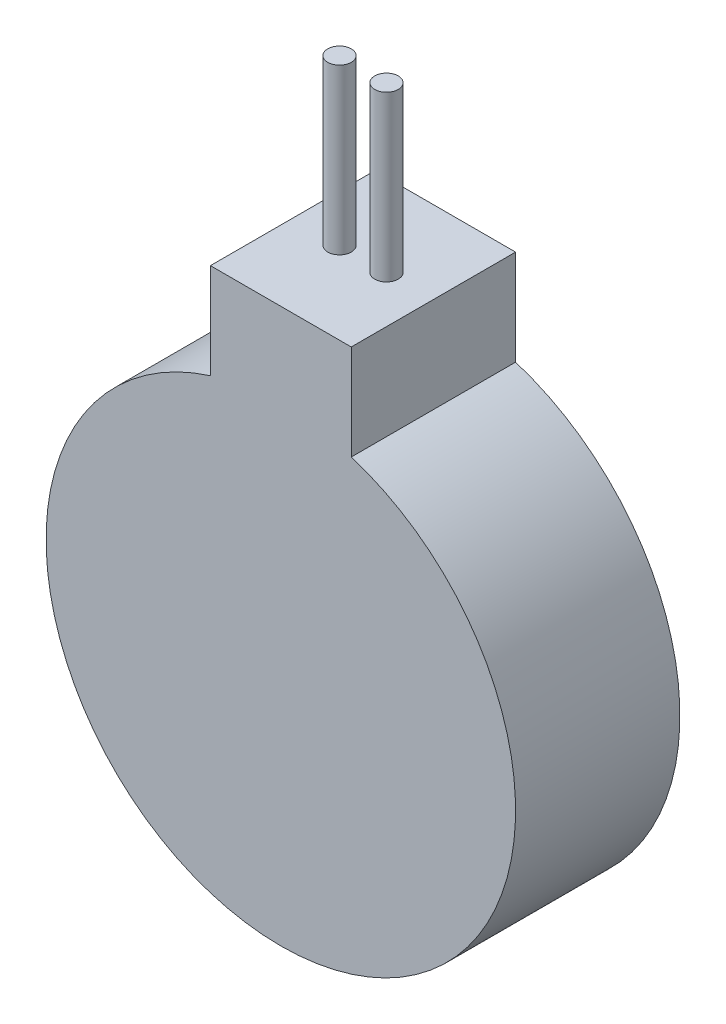
ISO-10303-21;
HEADER;
FILE_DESCRIPTION(('STEP AP214'),'2;1');
FILE_NAME('part.step','',(''),(''),'','','');
FILE_SCHEMA(('AUTOMOTIVE_DESIGN { 1 0 10303 214 1 1 1 1 }'));
ENDSEC;
DATA;
#1=APPLICATION_CONTEXT('core data for automotive mechanical design processes');
#2=APPLICATION_PROTOCOL_DEFINITION('international standard','automotive_design',2000,#1);
#3=PRODUCT_CONTEXT('',#1,'mechanical');
#4=PRODUCT('Part','Part','',(#3));
#5=PRODUCT_RELATED_PRODUCT_CATEGORY('part','',(#4));
#6=PRODUCT_DEFINITION_FORMATION('','',#4);
#7=PRODUCT_DEFINITION_CONTEXT('part definition',#1,'design');
#8=PRODUCT_DEFINITION('design','',#6,#7);
#9=PRODUCT_DEFINITION_SHAPE('','',#8);
#10=(LENGTH_UNIT() NAMED_UNIT(*) SI_UNIT(.MILLI.,.METRE.));
#11=(NAMED_UNIT(*) PLANE_ANGLE_UNIT() SI_UNIT($,.RADIAN.));
#12=(NAMED_UNIT(*) SI_UNIT($,.STERADIAN.) SOLID_ANGLE_UNIT());
#13=UNCERTAINTY_MEASURE_WITH_UNIT(LENGTH_MEASURE(1.E-05),#10,'distance_accuracy_value','');
#14=(GEOMETRIC_REPRESENTATION_CONTEXT(3) GLOBAL_UNCERTAINTY_ASSIGNED_CONTEXT((#13)) GLOBAL_UNIT_ASSIGNED_CONTEXT((#10,
#11,#12)) REPRESENTATION_CONTEXT('',''));
#15=CARTESIAN_POINT('',(0.,0.,0.));
#16=DIRECTION('',(0.,0.,1.));
#17=DIRECTION('',(1.,0.,0.));
#18=AXIS2_PLACEMENT_3D('',#15,#16,#17);
#19=CARTESIAN_POINT('',(-1.5,6.8,3.5));
#20=DIRECTION('',(0.,-1.,0.));
#21=DIRECTION('',(0.,0.,-1.));
#22=AXIS2_PLACEMENT_3D('',#19,#20,#21);
#23=PLANE('',#22);
#24=CARTESIAN_POINT('',(-0.5,6.8,1.75));
#25=DIRECTION('',(0.,-1.,0.));
#26=DIRECTION('',(0.,0.,-1.));
#27=AXIS2_PLACEMENT_3D('',#24,#25,#26);
#28=CIRCLE('',#27,0.25);
#29=CARTESIAN_POINT('',(-0.5,6.8,1.5));
#30=VERTEX_POINT('',#29);
#31=EDGE_CURVE('E42',#30,#30,#28,.F.);
#32=ORIENTED_EDGE('',*,*,#31,.F.);
#33=EDGE_LOOP('',(#32));
#34=FACE_BOUND('',#33,.T.);
#35=DIRECTION('',(-1.,0.,0.));
#36=VECTOR('',#35,1.);
#37=CARTESIAN_POINT('',(-1.5,6.8,0.));
#38=LINE('',#37,#36);
#39=CARTESIAN_POINT('',(1.5,6.8,0.));
#40=VERTEX_POINT('',#39);
#41=CARTESIAN_POINT('',(-1.5,6.8,0.));
#42=VERTEX_POINT('',#41);
#43=EDGE_CURVE('E91',#40,#42,#38,.T.);
#44=ORIENTED_EDGE('',*,*,#43,.T.);
#45=DIRECTION('',(0.,0.,-1.));
#46=VECTOR('',#45,1.);
#47=CARTESIAN_POINT('',(-1.5,6.8,3.5));
#48=LINE('',#47,#46);
#49=CARTESIAN_POINT('',(-1.5,6.8,3.5));
#50=VERTEX_POINT('',#49);
#51=EDGE_CURVE('E89',#50,#42,#48,.T.);
#52=ORIENTED_EDGE('',*,*,#51,.F.);
#53=DIRECTION('',(-1.,0.,0.));
#54=VECTOR('',#53,1.);
#55=CARTESIAN_POINT('',(-1.5,6.8,3.5));
#56=LINE('',#55,#54);
#57=CARTESIAN_POINT('',(1.5,6.8,3.5));
#58=VERTEX_POINT('',#57);
#59=EDGE_CURVE('E81',#58,#50,#56,.T.);
#60=ORIENTED_EDGE('',*,*,#59,.F.);
#61=DIRECTION('',(0.,0.,-1.));
#62=VECTOR('',#61,1.);
#63=CARTESIAN_POINT('',(1.5,6.8,3.5));
#64=LINE('',#63,#62);
#65=EDGE_CURVE('E92',#58,#40,#64,.T.);
#66=ORIENTED_EDGE('',*,*,#65,.T.);
#67=EDGE_LOOP('',(#44,#52,#60,#66));
#68=FACE_BOUND('',#67,.T.);
#69=CARTESIAN_POINT('',(0.500000000000001,6.8,1.75));
#70=DIRECTION('',(0.,-1.,0.));
#71=DIRECTION('',(0.,0.,-1.));
#72=AXIS2_PLACEMENT_3D('',#69,#70,#71);
#73=CIRCLE('',#72,0.25);
#74=CARTESIAN_POINT('',(0.500000000000001,6.8,1.5));
#75=VERTEX_POINT('',#74);
#76=EDGE_CURVE('E11',#75,#75,#73,.F.);
#77=ORIENTED_EDGE('',*,*,#76,.F.);
#78=EDGE_LOOP('',(#77));
#79=FACE_BOUND('',#78,.T.);
#80=ADVANCED_FACE('F33',(#34,#68,#79),#23,.F.);
#81=CARTESIAN_POINT('',(1.5,4.76969600708473,3.5));
#82=DIRECTION('',(-1.,0.,0.));
#83=DIRECTION('',(0.,0.,1.));
#84=AXIS2_PLACEMENT_3D('',#81,#82,#83);
#85=PLANE('',#84);
#86=DIRECTION('',(0.,1.,0.));
#87=VECTOR('',#86,1.);
#88=CARTESIAN_POINT('',(1.5,4.76969600708473,0.));
#89=LINE('',#88,#87);
#90=CARTESIAN_POINT('',(1.5,4.76969600708473,0.));
#91=VERTEX_POINT('',#90);
#92=EDGE_CURVE('E101',#91,#40,#89,.T.);
#93=ORIENTED_EDGE('',*,*,#92,.T.);
#94=ORIENTED_EDGE('',*,*,#65,.F.);
#95=DIRECTION('',(0.,1.,0.));
#96=VECTOR('',#95,1.);
#97=CARTESIAN_POINT('',(1.5,4.76969600708473,3.5));
#98=LINE('',#97,#96);
#99=CARTESIAN_POINT('',(1.5,4.76969600708473,3.5));
#100=VERTEX_POINT('',#99);
#101=EDGE_CURVE('E86',#100,#58,#98,.T.);
#102=ORIENTED_EDGE('',*,*,#101,.F.);
#103=DIRECTION('',(0.,0.,-1.));
#104=VECTOR('',#103,1.);
#105=CARTESIAN_POINT('',(1.5,4.76969600708473,3.5));
#106=LINE('',#105,#104);
#107=EDGE_CURVE('E97',#100,#91,#106,.T.);
#108=ORIENTED_EDGE('',*,*,#107,.T.);
#109=EDGE_LOOP('',(#93,#94,#102,#108));
#110=FACE_BOUND('',#109,.T.);
#111=ADVANCED_FACE('F35',(#110),#85,.F.);
#112=CARTESIAN_POINT('',(-1.5,4.76969600708473,3.5));
#113=DIRECTION('',(1.,0.,0.));
#114=DIRECTION('',(0.,1.,0.));
#115=AXIS2_PLACEMENT_3D('',#112,#113,#114);
#116=PLANE('',#115);
#117=DIRECTION('',(0.,-1.,0.));
#118=VECTOR('',#117,1.);
#119=CARTESIAN_POINT('',(-1.5,4.76969600708473,0.));
#120=LINE('',#119,#118);
#121=CARTESIAN_POINT('',(-1.5,4.76969600708473,0.));
#122=VERTEX_POINT('',#121);
#123=EDGE_CURVE('E67',#42,#122,#120,.T.);
#124=ORIENTED_EDGE('',*,*,#123,.T.);
#125=DIRECTION('',(0.,0.,-1.));
#126=VECTOR('',#125,1.);
#127=CARTESIAN_POINT('',(-1.5,4.76969600708473,3.5));
#128=LINE('',#127,#126);
#129=CARTESIAN_POINT('',(-1.5,4.76969600708473,3.5));
#130=VERTEX_POINT('',#129);
#131=EDGE_CURVE('E93',#130,#122,#128,.T.);
#132=ORIENTED_EDGE('',*,*,#131,.F.);
#133=DIRECTION('',(0.,-1.,0.));
#134=VECTOR('',#133,1.);
#135=CARTESIAN_POINT('',(-1.5,4.76969600708473,3.5));
#136=LINE('',#135,#134);
#137=EDGE_CURVE('E84',#50,#130,#136,.T.);
#138=ORIENTED_EDGE('',*,*,#137,.F.);
#139=ORIENTED_EDGE('',*,*,#51,.T.);
#140=EDGE_LOOP('',(#124,#132,#138,#139));
#141=FACE_BOUND('',#140,.T.);
#142=ADVANCED_FACE('F95',(#141),#116,.F.);
#143=CARTESIAN_POINT('',(0.,0.,3.5));
#144=DIRECTION('',(0.,0.,-1.));
#145=DIRECTION('',(-1.,0.,0.));
#146=AXIS2_PLACEMENT_3D('',#143,#144,#145);
#147=CYLINDRICAL_SURFACE('',#146,5.);
#148=CARTESIAN_POINT('',(0.,0.,0.));
#149=DIRECTION('',(0.,0.,1.));
#150=DIRECTION('',(1.,0.,0.));
#151=AXIS2_PLACEMENT_3D('',#148,#149,#150);
#152=CIRCLE('',#151,5.);
#153=EDGE_CURVE('E73',#122,#91,#152,.T.);
#154=ORIENTED_EDGE('',*,*,#153,.T.);
#155=ORIENTED_EDGE('',*,*,#107,.F.);
#156=CARTESIAN_POINT('',(0.,0.,3.5));
#157=DIRECTION('',(0.,0.,1.));
#158=DIRECTION('',(1.,0.,0.));
#159=AXIS2_PLACEMENT_3D('',#156,#157,#158);
#160=CIRCLE('',#159,5.);
#161=EDGE_CURVE('E50',#130,#100,#160,.T.);
#162=ORIENTED_EDGE('',*,*,#161,.F.);
#163=ORIENTED_EDGE('',*,*,#131,.T.);
#164=EDGE_LOOP('',(#154,#155,#162,#163));
#165=FACE_BOUND('',#164,.T.);
#166=ADVANCED_FACE('F123',(#165),#147,.T.);
#167=CARTESIAN_POINT('',(0.,0.,3.5));
#168=DIRECTION('',(0.,0.,1.));
#169=DIRECTION('',(1.,0.,0.));
#170=AXIS2_PLACEMENT_3D('',#167,#168,#169);
#171=PLANE('',#170);
#172=ORIENTED_EDGE('',*,*,#101,.T.);
#173=ORIENTED_EDGE('',*,*,#59,.T.);
#174=ORIENTED_EDGE('',*,*,#137,.T.);
#175=ORIENTED_EDGE('',*,*,#161,.T.);
#176=EDGE_LOOP('',(#172,#173,#174,#175));
#177=FACE_BOUND('',#176,.T.);
#178=ADVANCED_FACE('F82',(#177),#171,.T.);
#179=CARTESIAN_POINT('',(0.,0.,0.));
#180=DIRECTION('',(0.,0.,1.));
#181=DIRECTION('',(1.,0.,0.));
#182=AXIS2_PLACEMENT_3D('',#179,#180,#181);
#183=PLANE('',#182);
#184=ORIENTED_EDGE('',*,*,#92,.F.);
#185=ORIENTED_EDGE('',*,*,#153,.F.);
#186=ORIENTED_EDGE('',*,*,#123,.F.);
#187=ORIENTED_EDGE('',*,*,#43,.F.);
#188=EDGE_LOOP('',(#184,#185,#186,#187));
#189=FACE_BOUND('',#188,.T.);
#190=ADVANCED_FACE('F126',(#189),#183,.F.);
#191=CARTESIAN_POINT('',(-0.5,10.3,1.75));
#192=DIRECTION('',(0.,-1.,0.));
#193=DIRECTION('',(0.,0.,-1.));
#194=AXIS2_PLACEMENT_3D('',#191,#192,#193);
#195=CYLINDRICAL_SURFACE('',#194,0.25);
#196=CARTESIAN_POINT('',(-0.5,10.3,1.75));
#197=DIRECTION('',(0.,1.,0.));
#198=DIRECTION('',(0.,0.,1.));
#199=AXIS2_PLACEMENT_3D('',#196,#197,#198);
#200=CIRCLE('',#199,0.25);
#201=CARTESIAN_POINT('',(-0.5,10.3,2.));
#202=VERTEX_POINT('',#201);
#203=EDGE_CURVE('E104',#202,#202,#200,.T.);
#204=ORIENTED_EDGE('',*,*,#203,.F.);
#205=EDGE_LOOP('',(#204));
#206=FACE_BOUND('',#205,.T.);
#207=ORIENTED_EDGE('',*,*,#31,.T.);
#208=EDGE_LOOP('',(#207));
#209=FACE_BOUND('',#208,.T.);
#210=ADVANCED_FACE('F113',(#206,#209),#195,.T.);
#211=CARTESIAN_POINT('',(-0.5,10.3,1.75));
#212=DIRECTION('',(0.,1.,0.));
#213=DIRECTION('',(0.,0.,1.));
#214=AXIS2_PLACEMENT_3D('',#211,#212,#213);
#215=PLANE('',#214);
#216=ORIENTED_EDGE('',*,*,#203,.T.);
#217=EDGE_LOOP('',(#216));
#218=FACE_BOUND('',#217,.T.);
#219=ADVANCED_FACE('F134',(#218),#215,.T.);
#220=CARTESIAN_POINT('',(0.500000000000001,10.3,1.75));
#221=DIRECTION('',(0.,-1.,0.));
#222=DIRECTION('',(0.,0.,-1.));
#223=AXIS2_PLACEMENT_3D('',#220,#221,#222);
#224=CYLINDRICAL_SURFACE('',#223,0.25);
#225=CARTESIAN_POINT('',(0.500000000000001,10.3,1.75));
#226=DIRECTION('',(0.,1.,0.));
#227=DIRECTION('',(0.,0.,1.));
#228=AXIS2_PLACEMENT_3D('',#225,#226,#227);
#229=CIRCLE('',#228,0.25);
#230=CARTESIAN_POINT('',(0.500000000000001,10.3,2.));
#231=VERTEX_POINT('',#230);
#232=EDGE_CURVE('E150',#231,#231,#229,.T.);
#233=ORIENTED_EDGE('',*,*,#232,.F.);
#234=EDGE_LOOP('',(#233));
#235=FACE_BOUND('',#234,.T.);
#236=ORIENTED_EDGE('',*,*,#76,.T.);
#237=EDGE_LOOP('',(#236));
#238=FACE_BOUND('',#237,.T.);
#239=ADVANCED_FACE('F138',(#235,#238),#224,.T.);
#240=CARTESIAN_POINT('',(0.500000000000001,10.3,1.75));
#241=DIRECTION('',(0.,1.,0.));
#242=DIRECTION('',(0.,0.,1.));
#243=AXIS2_PLACEMENT_3D('',#240,#241,#242);
#244=PLANE('',#243);
#245=ORIENTED_EDGE('',*,*,#232,.T.);
#246=EDGE_LOOP('',(#245));
#247=FACE_BOUND('',#246,.T.);
#248=ADVANCED_FACE('F142',(#247),#244,.T.);
#249=CLOSED_SHELL('',(#80,#111,#142,#166,#178,#190,#210,#219,#239,#248));
#250=MANIFOLD_SOLID_BREP('B2',#249);
#251=ADVANCED_BREP_SHAPE_REPRESENTATION('',(#18,#250),#14);
#252=SHAPE_DEFINITION_REPRESENTATION(#9,#251);
ENDSEC;
END-ISO-10303-21;
